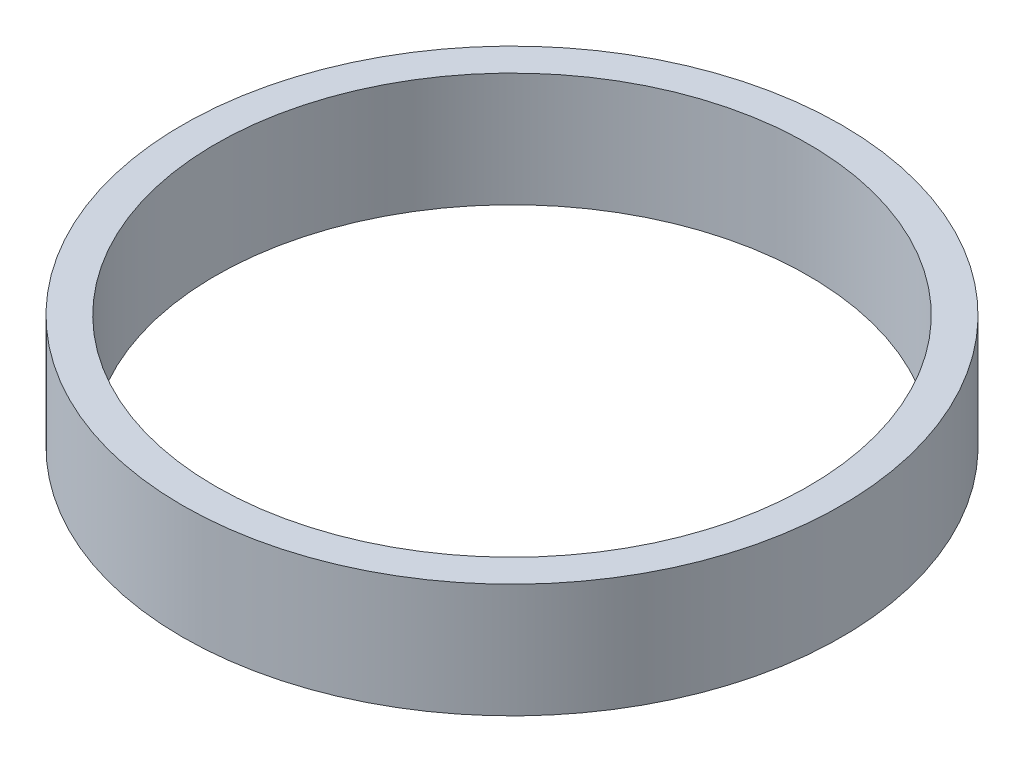
ISO-10303-21;
HEADER;
FILE_DESCRIPTION(('STEP AP214'),'2;1');
FILE_NAME('part.step','',(''),(''),'','','');
FILE_SCHEMA(('AUTOMOTIVE_DESIGN { 1 0 10303 214 1 1 1 1 }'));
ENDSEC;
DATA;
#1=APPLICATION_CONTEXT('core data for automotive mechanical design processes');
#2=APPLICATION_PROTOCOL_DEFINITION('international standard','automotive_design',2000,#1);
#3=PRODUCT_CONTEXT('',#1,'mechanical');
#4=PRODUCT('Part','Part','',(#3));
#5=PRODUCT_RELATED_PRODUCT_CATEGORY('part','',(#4));
#6=PRODUCT_DEFINITION_FORMATION('','',#4);
#7=PRODUCT_DEFINITION_CONTEXT('part definition',#1,'design');
#8=PRODUCT_DEFINITION('design','',#6,#7);
#9=PRODUCT_DEFINITION_SHAPE('','',#8);
#10=(LENGTH_UNIT() NAMED_UNIT(*) SI_UNIT(.MILLI.,.METRE.));
#11=(NAMED_UNIT(*) PLANE_ANGLE_UNIT() SI_UNIT($,.RADIAN.));
#12=(NAMED_UNIT(*) SI_UNIT($,.STERADIAN.) SOLID_ANGLE_UNIT());
#13=UNCERTAINTY_MEASURE_WITH_UNIT(LENGTH_MEASURE(1.E-05),#10,'distance_accuracy_value','');
#14=(GEOMETRIC_REPRESENTATION_CONTEXT(3) GLOBAL_UNCERTAINTY_ASSIGNED_CONTEXT((#13)) GLOBAL_UNIT_ASSIGNED_CONTEXT((#10,
#11,#12)) REPRESENTATION_CONTEXT('',''));
#15=CARTESIAN_POINT('',(0.,0.,0.));
#16=DIRECTION('',(0.,0.,1.));
#17=DIRECTION('',(1.,0.,0.));
#18=AXIS2_PLACEMENT_3D('',#15,#16,#17);
#19=CARTESIAN_POINT('',(0.,10.,0.));
#20=DIRECTION('',(0.,1.,0.));
#21=DIRECTION('',(0.,0.,1.));
#22=AXIS2_PLACEMENT_3D('',#19,#20,#21);
#23=PLANE('',#22);
#24=CARTESIAN_POINT('',(0.,10.,0.));
#25=DIRECTION('',(0.,1.,0.));
#26=DIRECTION('',(0.,0.,1.));
#27=AXIS2_PLACEMENT_3D('',#24,#25,#26);
#28=CIRCLE('',#27,28.9);
#29=CARTESIAN_POINT('',(0.,10.,28.9));
#30=VERTEX_POINT('',#29);
#31=EDGE_CURVE('E10',#30,#30,#28,.T.);
#32=ORIENTED_EDGE('',*,*,#31,.T.);
#33=EDGE_LOOP('',(#32));
#34=FACE_BOUND('',#33,.T.);
#35=CARTESIAN_POINT('',(0.,10.,0.));
#36=DIRECTION('',(0.,1.,0.));
#37=DIRECTION('',(0.,0.,1.));
#38=AXIS2_PLACEMENT_3D('',#35,#36,#37);
#39=CIRCLE('',#38,26.);
#40=CARTESIAN_POINT('',(0.,10.,26.));
#41=VERTEX_POINT('',#40);
#42=EDGE_CURVE('E42',#41,#41,#39,.T.);
#43=ORIENTED_EDGE('',*,*,#42,.F.);
#44=EDGE_LOOP('',(#43));
#45=FACE_BOUND('',#44,.T.);
#46=ADVANCED_FACE('F31',(#34,#45),#23,.T.);
#47=CARTESIAN_POINT('',(0.,0.,0.));
#48=DIRECTION('',(0.,1.,0.));
#49=DIRECTION('',(0.,0.,1.));
#50=AXIS2_PLACEMENT_3D('',#47,#48,#49);
#51=PLANE('',#50);
#52=CARTESIAN_POINT('',(0.,0.,0.));
#53=DIRECTION('',(0.,1.,0.));
#54=DIRECTION('',(0.,0.,1.));
#55=AXIS2_PLACEMENT_3D('',#52,#53,#54);
#56=CIRCLE('',#55,28.9);
#57=CARTESIAN_POINT('',(0.,0.,28.9));
#58=VERTEX_POINT('',#57);
#59=EDGE_CURVE('E35',#58,#58,#56,.T.);
#60=ORIENTED_EDGE('',*,*,#59,.F.);
#61=EDGE_LOOP('',(#60));
#62=FACE_BOUND('',#61,.T.);
#63=CARTESIAN_POINT('',(0.,0.,0.));
#64=DIRECTION('',(0.,1.,0.));
#65=DIRECTION('',(0.,0.,1.));
#66=AXIS2_PLACEMENT_3D('',#63,#64,#65);
#67=CIRCLE('',#66,26.);
#68=CARTESIAN_POINT('',(0.,0.,26.));
#69=VERTEX_POINT('',#68);
#70=EDGE_CURVE('E44',#69,#69,#67,.T.);
#71=ORIENTED_EDGE('',*,*,#70,.T.);
#72=EDGE_LOOP('',(#71));
#73=FACE_BOUND('',#72,.T.);
#74=ADVANCED_FACE('F54',(#62,#73),#51,.F.);
#75=CARTESIAN_POINT('',(0.,10.,0.));
#76=DIRECTION('',(0.,-1.,0.));
#77=DIRECTION('',(0.,0.,-1.));
#78=AXIS2_PLACEMENT_3D('',#75,#76,#77);
#79=CYLINDRICAL_SURFACE('',#78,28.9);
#80=ORIENTED_EDGE('',*,*,#31,.F.);
#81=EDGE_LOOP('',(#80));
#82=FACE_BOUND('',#81,.T.);
#83=ORIENTED_EDGE('',*,*,#59,.T.);
#84=EDGE_LOOP('',(#83));
#85=FACE_BOUND('',#84,.T.);
#86=ADVANCED_FACE('F33',(#82,#85),#79,.T.);
#87=CARTESIAN_POINT('',(0.,10.,0.));
#88=DIRECTION('',(0.,-1.,0.));
#89=DIRECTION('',(0.,0.,-1.));
#90=AXIS2_PLACEMENT_3D('',#87,#88,#89);
#91=CYLINDRICAL_SURFACE('',#90,26.);
#92=ORIENTED_EDGE('',*,*,#42,.T.);
#93=EDGE_LOOP('',(#92));
#94=FACE_BOUND('',#93,.T.);
#95=ORIENTED_EDGE('',*,*,#70,.F.);
#96=EDGE_LOOP('',(#95));
#97=FACE_BOUND('',#96,.T.);
#98=ADVANCED_FACE('F50',(#94,#97),#91,.F.);
#99=CLOSED_SHELL('',(#46,#74,#86,#98));
#100=MANIFOLD_SOLID_BREP('B2',#99);
#101=ADVANCED_BREP_SHAPE_REPRESENTATION('',(#18,#100),#14);
#102=SHAPE_DEFINITION_REPRESENTATION(#9,#101);
ENDSEC;
END-ISO-10303-21;
